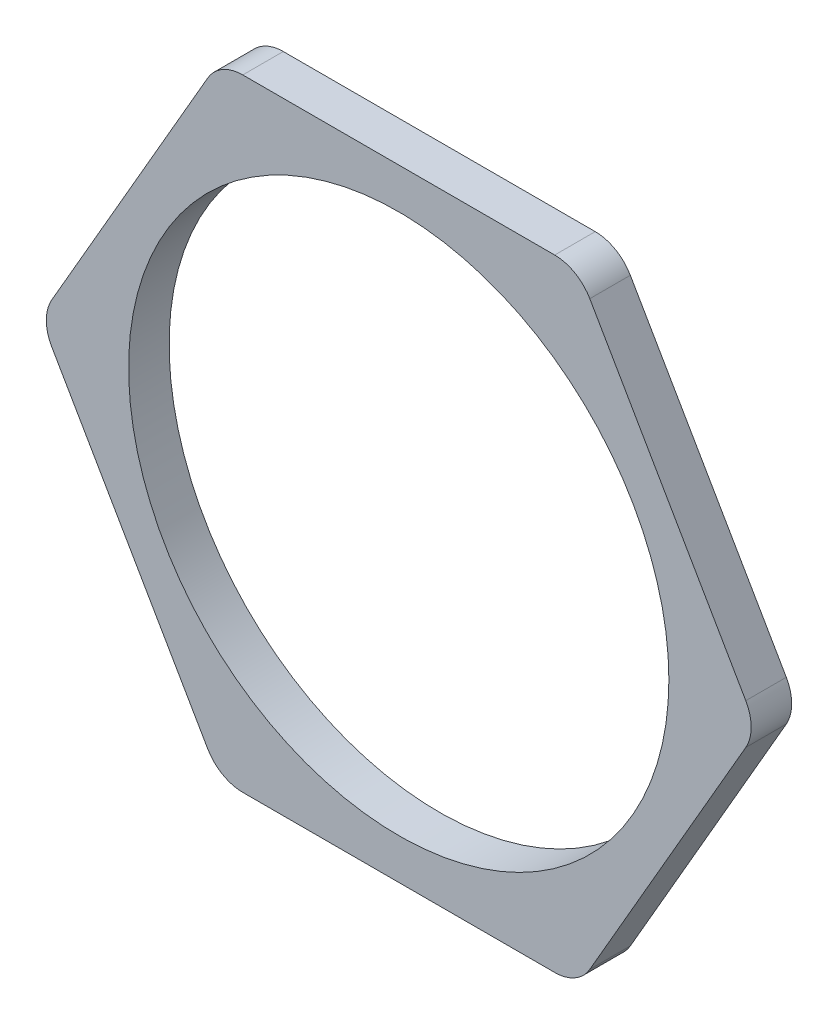
ISO-10303-21;
HEADER;
FILE_DESCRIPTION(('STEP AP214'),'2;1');
FILE_NAME('part.step','',(''),(''),'','','');
FILE_SCHEMA(('AUTOMOTIVE_DESIGN { 1 0 10303 214 1 1 1 1 }'));
ENDSEC;
DATA;
#1=APPLICATION_CONTEXT('core data for automotive mechanical design processes');
#2=APPLICATION_PROTOCOL_DEFINITION('international standard','automotive_design',2000,#1);
#3=PRODUCT_CONTEXT('',#1,'mechanical');
#4=PRODUCT('Part','Part','',(#3));
#5=PRODUCT_RELATED_PRODUCT_CATEGORY('part','',(#4));
#6=PRODUCT_DEFINITION_FORMATION('','',#4);
#7=PRODUCT_DEFINITION_CONTEXT('part definition',#1,'design');
#8=PRODUCT_DEFINITION('design','',#6,#7);
#9=PRODUCT_DEFINITION_SHAPE('','',#8);
#10=(LENGTH_UNIT() NAMED_UNIT(*) SI_UNIT(.MILLI.,.METRE.));
#11=(NAMED_UNIT(*) PLANE_ANGLE_UNIT() SI_UNIT($,.RADIAN.));
#12=(NAMED_UNIT(*) SI_UNIT($,.STERADIAN.) SOLID_ANGLE_UNIT());
#13=UNCERTAINTY_MEASURE_WITH_UNIT(LENGTH_MEASURE(1.E-05),#10,'distance_accuracy_value','');
#14=(GEOMETRIC_REPRESENTATION_CONTEXT(3) GLOBAL_UNCERTAINTY_ASSIGNED_CONTEXT((#13)) GLOBAL_UNIT_ASSIGNED_CONTEXT((#10,
#11,#12)) REPRESENTATION_CONTEXT('',''));
#15=CARTESIAN_POINT('',(0.,0.,0.));
#16=DIRECTION('',(0.,0.,1.));
#17=DIRECTION('',(1.,0.,0.));
#18=AXIS2_PLACEMENT_3D('',#15,#16,#17);
#19=CARTESIAN_POINT('',(0.,0.,3.));
#20=DIRECTION('',(0.,0.,1.));
#21=DIRECTION('',(1.,0.,0.));
#22=AXIS2_PLACEMENT_3D('',#19,#20,#21);
#23=PLANE('',#22);
#24=DIRECTION('',(-1.,0.,0.));
#25=VECTOR('',#24,1.);
#26=CARTESIAN_POINT('',(-13.2790561913612,23.0000000000002,3.));
#27=LINE('',#26,#25);
#28=CARTESIAN_POINT('',(11.5470053837924,23.0000000000002,3.));
#29=VERTEX_POINT('',#28);
#30=CARTESIAN_POINT('',(-11.5470053837924,23.0000000000002,3.));
#31=VERTEX_POINT('',#30);
#32=EDGE_CURVE('E220',#29,#31,#27,.T.);
#33=ORIENTED_EDGE('',*,*,#32,.T.);
#34=CARTESIAN_POINT('',(-11.5470053837924,20.0000000000002,3.));
#35=DIRECTION('',(0.,0.,1.));
#36=DIRECTION('',(1.,0.,0.));
#37=AXIS2_PLACEMENT_3D('',#34,#35,#36);
#38=CIRCLE('',#37,3.);
#39=CARTESIAN_POINT('',(-14.1450815951457,21.5000000000002,3.));
#40=VERTEX_POINT('',#39);
#41=EDGE_CURVE('E181',#31,#40,#38,.T.);
#42=ORIENTED_EDGE('',*,*,#41,.T.);
#43=DIRECTION('',(-0.500000000000004,-0.866025403784437,0.));
#44=VECTOR('',#43,1.);
#45=CARTESIAN_POINT('',(-13.2790561913612,23.0000000000002,3.));
#46=LINE('',#45,#44);
#47=CARTESIAN_POINT('',(-25.6920869789384,1.5,3.));
#48=VERTEX_POINT('',#47);
#49=EDGE_CURVE('E143',#40,#48,#46,.T.);
#50=ORIENTED_EDGE('',*,*,#49,.T.);
#51=CARTESIAN_POINT('',(-23.0940107675851,0.,3.));
#52=DIRECTION('',(0.,0.,1.));
#53=DIRECTION('',(1.,0.,0.));
#54=AXIS2_PLACEMENT_3D('',#51,#52,#53);
#55=CIRCLE('',#54,3.);
#56=CARTESIAN_POINT('',(-25.6920869789384,-1.50000000000001,3.));
#57=VERTEX_POINT('',#56);
#58=EDGE_CURVE('E179',#48,#57,#55,.T.);
#59=ORIENTED_EDGE('',*,*,#58,.T.);
#60=DIRECTION('',(0.500000000000004,-0.866025403784436,0.));
#61=VECTOR('',#60,1.);
#62=CARTESIAN_POINT('',(-13.2790561913612,-23.0000000000002,3.));
#63=LINE('',#62,#61);
#64=CARTESIAN_POINT('',(-14.1450815951457,-21.5000000000002,3.));
#65=VERTEX_POINT('',#64);
#66=EDGE_CURVE('E150',#57,#65,#63,.T.);
#67=ORIENTED_EDGE('',*,*,#66,.T.);
#68=CARTESIAN_POINT('',(-11.5470053837924,-20.0000000000002,3.));
#69=DIRECTION('',(0.,0.,1.));
#70=DIRECTION('',(1.,0.,0.));
#71=AXIS2_PLACEMENT_3D('',#68,#69,#70);
#72=CIRCLE('',#71,3.);
#73=CARTESIAN_POINT('',(-11.5470053837924,-23.0000000000002,3.));
#74=VERTEX_POINT('',#73);
#75=EDGE_CURVE('E177',#65,#74,#72,.T.);
#76=ORIENTED_EDGE('',*,*,#75,.T.);
#77=DIRECTION('',(1.,0.,0.));
#78=VECTOR('',#77,1.);
#79=CARTESIAN_POINT('',(-13.2790561913612,-23.0000000000002,3.));
#80=LINE('',#79,#78);
#81=CARTESIAN_POINT('',(11.5470053837924,-23.0000000000002,3.));
#82=VERTEX_POINT('',#81);
#83=EDGE_CURVE('E154',#74,#82,#80,.T.);
#84=ORIENTED_EDGE('',*,*,#83,.T.);
#85=CARTESIAN_POINT('',(11.5470053837924,-20.0000000000002,3.));
#86=DIRECTION('',(0.,0.,1.));
#87=DIRECTION('',(1.,0.,0.));
#88=AXIS2_PLACEMENT_3D('',#85,#86,#87);
#89=CIRCLE('',#88,3.);
#90=CARTESIAN_POINT('',(14.1450815951457,-21.5000000000002,3.));
#91=VERTEX_POINT('',#90);
#92=EDGE_CURVE('E175',#82,#91,#89,.T.);
#93=ORIENTED_EDGE('',*,*,#92,.T.);
#94=DIRECTION('',(0.500000000000004,0.866025403784436,0.));
#95=VECTOR('',#94,1.);
#96=CARTESIAN_POINT('',(13.2790561913612,-23.0000000000002,3.));
#97=LINE('',#96,#95);
#98=CARTESIAN_POINT('',(25.6920869789384,-1.50000000000002,3.));
#99=VERTEX_POINT('',#98);
#100=EDGE_CURVE('E205',#91,#99,#97,.T.);
#101=ORIENTED_EDGE('',*,*,#100,.T.);
#102=CARTESIAN_POINT('',(23.0940107675851,0.,3.));
#103=DIRECTION('',(0.,0.,1.));
#104=DIRECTION('',(1.,0.,0.));
#105=AXIS2_PLACEMENT_3D('',#102,#103,#104);
#106=CIRCLE('',#105,3.);
#107=CARTESIAN_POINT('',(25.6920869789384,1.5,3.));
#108=VERTEX_POINT('',#107);
#109=EDGE_CURVE('E54',#99,#108,#106,.T.);
#110=ORIENTED_EDGE('',*,*,#109,.T.);
#111=DIRECTION('',(-0.500000000000004,0.866025403784437,0.));
#112=VECTOR('',#111,1.);
#113=CARTESIAN_POINT('',(13.2790561913612,23.0000000000002,3.));
#114=LINE('',#113,#112);
#115=CARTESIAN_POINT('',(14.1450815951457,21.5000000000002,3.));
#116=VERTEX_POINT('',#115);
#117=EDGE_CURVE('E223',#108,#116,#114,.T.);
#118=ORIENTED_EDGE('',*,*,#117,.T.);
#119=CARTESIAN_POINT('',(11.5470053837924,20.0000000000002,3.));
#120=DIRECTION('',(0.,0.,1.));
#121=DIRECTION('',(1.,0.,0.));
#122=AXIS2_PLACEMENT_3D('',#119,#120,#121);
#123=CIRCLE('',#122,3.);
#124=EDGE_CURVE('E172',#116,#29,#123,.T.);
#125=ORIENTED_EDGE('',*,*,#124,.T.);
#126=EDGE_LOOP('',(#33,#42,#50,#59,#67,#76,#84,#93,#101,#110,#118,#125));
#127=FACE_BOUND('',#126,.T.);
#128=CARTESIAN_POINT('',(0.,0.,3.));
#129=DIRECTION('',(0.,0.,1.));
#130=DIRECTION('',(1.,0.,0.));
#131=AXIS2_PLACEMENT_3D('',#128,#129,#130);
#132=CIRCLE('',#131,20.);
#133=CARTESIAN_POINT('',(20.,0.,3.));
#134=VERTEX_POINT('',#133);
#135=EDGE_CURVE('E218',#134,#134,#132,.T.);
#136=ORIENTED_EDGE('',*,*,#135,.F.);
#137=EDGE_LOOP('',(#136));
#138=FACE_BOUND('',#137,.T.);
#139=ADVANCED_FACE('F33',(#127,#138),#23,.T.);
#140=CARTESIAN_POINT('',(0.,0.,0.));
#141=DIRECTION('',(0.,0.,1.));
#142=DIRECTION('',(1.,0.,0.));
#143=AXIS2_PLACEMENT_3D('',#140,#141,#142);
#144=PLANE('',#143);
#145=DIRECTION('',(-0.500000000000004,-0.866025403784437,0.));
#146=VECTOR('',#145,1.);
#147=CARTESIAN_POINT('',(-13.2790561913612,23.0000000000002,0.));
#148=LINE('',#147,#146);
#149=CARTESIAN_POINT('',(-14.1450815951457,21.5000000000002,0.));
#150=VERTEX_POINT('',#149);
#151=CARTESIAN_POINT('',(-25.6920869789384,1.5,0.));
#152=VERTEX_POINT('',#151);
#153=EDGE_CURVE('E140',#150,#152,#148,.T.);
#154=ORIENTED_EDGE('',*,*,#153,.F.);
#155=CARTESIAN_POINT('',(-11.5470053837924,20.0000000000002,0.));
#156=DIRECTION('',(0.,0.,1.));
#157=DIRECTION('',(1.,0.,0.));
#158=AXIS2_PLACEMENT_3D('',#155,#156,#157);
#159=CIRCLE('',#158,3.);
#160=CARTESIAN_POINT('',(-11.5470053837924,23.0000000000002,0.));
#161=VERTEX_POINT('',#160);
#162=EDGE_CURVE('E123',#150,#161,#159,.F.);
#163=ORIENTED_EDGE('',*,*,#162,.T.);
#164=DIRECTION('',(-1.,0.,0.));
#165=VECTOR('',#164,1.);
#166=CARTESIAN_POINT('',(-13.2790561913612,23.0000000000002,0.));
#167=LINE('',#166,#165);
#168=CARTESIAN_POINT('',(11.5470053837924,23.0000000000002,0.));
#169=VERTEX_POINT('',#168);
#170=EDGE_CURVE('E151',#169,#161,#167,.T.);
#171=ORIENTED_EDGE('',*,*,#170,.F.);
#172=CARTESIAN_POINT('',(11.5470053837924,20.0000000000002,0.));
#173=DIRECTION('',(0.,0.,1.));
#174=DIRECTION('',(1.,0.,0.));
#175=AXIS2_PLACEMENT_3D('',#172,#173,#174);
#176=CIRCLE('',#175,3.);
#177=CARTESIAN_POINT('',(14.1450815951457,21.5000000000002,0.));
#178=VERTEX_POINT('',#177);
#179=EDGE_CURVE('E144',#169,#178,#176,.F.);
#180=ORIENTED_EDGE('',*,*,#179,.T.);
#181=DIRECTION('',(-0.500000000000004,0.866025403784437,0.));
#182=VECTOR('',#181,1.);
#183=CARTESIAN_POINT('',(13.2790561913612,23.0000000000002,0.));
#184=LINE('',#183,#182);
#185=CARTESIAN_POINT('',(25.6920869789384,1.5,0.));
#186=VERTEX_POINT('',#185);
#187=EDGE_CURVE('E156',#186,#178,#184,.T.);
#188=ORIENTED_EDGE('',*,*,#187,.F.);
#189=CARTESIAN_POINT('',(23.0940107675851,0.,0.));
#190=DIRECTION('',(0.,0.,1.));
#191=DIRECTION('',(1.,0.,0.));
#192=AXIS2_PLACEMENT_3D('',#189,#190,#191);
#193=CIRCLE('',#192,3.);
#194=CARTESIAN_POINT('',(25.6920869789384,-1.50000000000002,0.));
#195=VERTEX_POINT('',#194);
#196=EDGE_CURVE('E162',#186,#195,#193,.F.);
#197=ORIENTED_EDGE('',*,*,#196,.T.);
#198=DIRECTION('',(0.500000000000004,0.866025403784436,0.));
#199=VECTOR('',#198,1.);
#200=CARTESIAN_POINT('',(13.2790561913612,-23.0000000000002,0.));
#201=LINE('',#200,#199);
#202=CARTESIAN_POINT('',(14.1450815951457,-21.5000000000002,0.));
#203=VERTEX_POINT('',#202);
#204=EDGE_CURVE('E203',#203,#195,#201,.T.);
#205=ORIENTED_EDGE('',*,*,#204,.F.);
#206=CARTESIAN_POINT('',(11.5470053837924,-20.0000000000002,0.));
#207=DIRECTION('',(0.,0.,1.));
#208=DIRECTION('',(1.,0.,0.));
#209=AXIS2_PLACEMENT_3D('',#206,#207,#208);
#210=CIRCLE('',#209,3.);
#211=CARTESIAN_POINT('',(11.5470053837924,-23.0000000000002,0.));
#212=VERTEX_POINT('',#211);
#213=EDGE_CURVE('E164',#203,#212,#210,.F.);
#214=ORIENTED_EDGE('',*,*,#213,.T.);
#215=DIRECTION('',(1.,0.,0.));
#216=VECTOR('',#215,1.);
#217=CARTESIAN_POINT('',(-13.2790561913612,-23.0000000000002,0.));
#218=LINE('',#217,#216);
#219=CARTESIAN_POINT('',(-11.5470053837924,-23.0000000000002,0.));
#220=VERTEX_POINT('',#219);
#221=EDGE_CURVE('E211',#220,#212,#218,.T.);
#222=ORIENTED_EDGE('',*,*,#221,.F.);
#223=CARTESIAN_POINT('',(-11.5470053837924,-20.0000000000002,0.));
#224=DIRECTION('',(0.,0.,1.));
#225=DIRECTION('',(1.,0.,0.));
#226=AXIS2_PLACEMENT_3D('',#223,#224,#225);
#227=CIRCLE('',#226,3.);
#228=CARTESIAN_POINT('',(-14.1450815951457,-21.5000000000002,0.));
#229=VERTEX_POINT('',#228);
#230=EDGE_CURVE('E166',#220,#229,#227,.F.);
#231=ORIENTED_EDGE('',*,*,#230,.T.);
#232=DIRECTION('',(0.500000000000004,-0.866025403784436,0.));
#233=VECTOR('',#232,1.);
#234=CARTESIAN_POINT('',(-13.2790561913612,-23.0000000000002,0.));
#235=LINE('',#234,#233);
#236=CARTESIAN_POINT('',(-25.6920869789384,-1.50000000000001,0.));
#237=VERTEX_POINT('',#236);
#238=EDGE_CURVE('E213',#237,#229,#235,.T.);
#239=ORIENTED_EDGE('',*,*,#238,.F.);
#240=CARTESIAN_POINT('',(-23.0940107675851,0.,0.));
#241=DIRECTION('',(0.,0.,1.));
#242=DIRECTION('',(1.,0.,0.));
#243=AXIS2_PLACEMENT_3D('',#240,#241,#242);
#244=CIRCLE('',#243,3.);
#245=EDGE_CURVE('E134',#237,#152,#244,.F.);
#246=ORIENTED_EDGE('',*,*,#245,.T.);
#247=EDGE_LOOP('',(#154,#163,#171,#180,#188,#197,#205,#214,#222,#231,#239,#246));
#248=FACE_BOUND('',#247,.T.);
#249=CARTESIAN_POINT('',(0.,0.,0.));
#250=DIRECTION('',(0.,0.,1.));
#251=DIRECTION('',(1.,0.,0.));
#252=AXIS2_PLACEMENT_3D('',#249,#250,#251);
#253=CIRCLE('',#252,20.);
#254=CARTESIAN_POINT('',(20.,0.,0.));
#255=VERTEX_POINT('',#254);
#256=EDGE_CURVE('E228',#255,#255,#253,.T.);
#257=ORIENTED_EDGE('',*,*,#256,.T.);
#258=EDGE_LOOP('',(#257));
#259=FACE_BOUND('',#258,.T.);
#260=ADVANCED_FACE('F147',(#248,#259),#144,.F.);
#261=CARTESIAN_POINT('',(-13.2790561913612,-23.0000000000002,3.));
#262=DIRECTION('',(0.866025403784436,0.500000000000004,0.));
#263=DIRECTION('',(-0.500000000000004,0.866025403784436,0.));
#264=AXIS2_PLACEMENT_3D('',#261,#262,#263);
#265=PLANE('',#264);
#266=ORIENTED_EDGE('',*,*,#66,.F.);
#267=DIRECTION('',(0.,0.,-1.));
#268=VECTOR('',#267,1.);
#269=CARTESIAN_POINT('',(-25.6920869789384,-1.50000000000001,3.));
#270=LINE('',#269,#268);
#271=EDGE_CURVE('E185',#57,#237,#270,.T.);
#272=ORIENTED_EDGE('',*,*,#271,.T.);
#273=ORIENTED_EDGE('',*,*,#238,.T.);
#274=DIRECTION('',(0.,0.,-1.));
#275=VECTOR('',#274,1.);
#276=CARTESIAN_POINT('',(-14.1450815951457,-21.5000000000002,3.));
#277=LINE('',#276,#275);
#278=EDGE_CURVE('E183',#229,#65,#277,.F.);
#279=ORIENTED_EDGE('',*,*,#278,.T.);
#280=EDGE_LOOP('',(#266,#272,#273,#279));
#281=FACE_BOUND('',#280,.T.);
#282=ADVANCED_FACE('F242',(#281),#265,.F.);
#283=CARTESIAN_POINT('',(-13.2790561913612,-23.0000000000002,3.));
#284=DIRECTION('',(0.,1.,0.));
#285=DIRECTION('',(0.,0.,1.));
#286=AXIS2_PLACEMENT_3D('',#283,#284,#285);
#287=PLANE('',#286);
#288=ORIENTED_EDGE('',*,*,#83,.F.);
#289=DIRECTION('',(0.,0.,-1.));
#290=VECTOR('',#289,1.);
#291=CARTESIAN_POINT('',(-11.5470053837924,-23.0000000000002,3.));
#292=LINE('',#291,#290);
#293=EDGE_CURVE('E190',#74,#220,#292,.T.);
#294=ORIENTED_EDGE('',*,*,#293,.T.);
#295=ORIENTED_EDGE('',*,*,#221,.T.);
#296=DIRECTION('',(0.,0.,-1.));
#297=VECTOR('',#296,1.);
#298=CARTESIAN_POINT('',(11.5470053837924,-23.0000000000002,3.));
#299=LINE('',#298,#297);
#300=EDGE_CURVE('E188',#212,#82,#299,.F.);
#301=ORIENTED_EDGE('',*,*,#300,.T.);
#302=EDGE_LOOP('',(#288,#294,#295,#301));
#303=FACE_BOUND('',#302,.T.);
#304=ADVANCED_FACE('F257',(#303),#287,.F.);
#305=CARTESIAN_POINT('',(13.2790561913612,-23.0000000000002,3.));
#306=DIRECTION('',(-0.866025403784436,0.500000000000004,0.));
#307=DIRECTION('',(-0.500000000000004,-0.866025403784436,0.));
#308=AXIS2_PLACEMENT_3D('',#305,#306,#307);
#309=PLANE('',#308);
#310=ORIENTED_EDGE('',*,*,#100,.F.);
#311=DIRECTION('',(0.,0.,-1.));
#312=VECTOR('',#311,1.);
#313=CARTESIAN_POINT('',(14.1450815951457,-21.5000000000002,3.));
#314=LINE('',#313,#312);
#315=EDGE_CURVE('E195',#91,#203,#314,.T.);
#316=ORIENTED_EDGE('',*,*,#315,.T.);
#317=ORIENTED_EDGE('',*,*,#204,.T.);
#318=DIRECTION('',(0.,0.,-1.));
#319=VECTOR('',#318,1.);
#320=CARTESIAN_POINT('',(25.6920869789384,-1.50000000000002,3.));
#321=LINE('',#320,#319);
#322=EDGE_CURVE('E193',#195,#99,#321,.F.);
#323=ORIENTED_EDGE('',*,*,#322,.T.);
#324=EDGE_LOOP('',(#310,#316,#317,#323));
#325=FACE_BOUND('',#324,.T.);
#326=ADVANCED_FACE('F202',(#325),#309,.F.);
#327=CARTESIAN_POINT('',(13.2790561913612,23.0000000000002,3.));
#328=DIRECTION('',(-0.866025403784436,-0.500000000000004,0.));
#329=DIRECTION('',(0.500000000000004,-0.866025403784437,0.));
#330=AXIS2_PLACEMENT_3D('',#327,#328,#329);
#331=PLANE('',#330);
#332=ORIENTED_EDGE('',*,*,#117,.F.);
#333=DIRECTION('',(0.,0.,-1.));
#334=VECTOR('',#333,1.);
#335=CARTESIAN_POINT('',(25.6920869789384,1.5,3.));
#336=LINE('',#335,#334);
#337=EDGE_CURVE('E11',#108,#186,#336,.T.);
#338=ORIENTED_EDGE('',*,*,#337,.T.);
#339=ORIENTED_EDGE('',*,*,#187,.T.);
#340=DIRECTION('',(0.,0.,-1.));
#341=VECTOR('',#340,1.);
#342=CARTESIAN_POINT('',(14.1450815951457,21.5000000000002,3.));
#343=LINE('',#342,#341);
#344=EDGE_CURVE('E41',#178,#116,#343,.F.);
#345=ORIENTED_EDGE('',*,*,#344,.T.);
#346=EDGE_LOOP('',(#332,#338,#339,#345));
#347=FACE_BOUND('',#346,.T.);
#348=ADVANCED_FACE('F251',(#347),#331,.F.);
#349=CARTESIAN_POINT('',(-13.2790561913612,23.0000000000002,3.));
#350=DIRECTION('',(0.,-1.,0.));
#351=DIRECTION('',(0.,0.,-1.));
#352=AXIS2_PLACEMENT_3D('',#349,#350,#351);
#353=PLANE('',#352);
#354=ORIENTED_EDGE('',*,*,#170,.T.);
#355=DIRECTION('',(0.,0.,-1.));
#356=VECTOR('',#355,1.);
#357=CARTESIAN_POINT('',(-11.5470053837924,23.0000000000002,3.));
#358=LINE('',#357,#356);
#359=EDGE_CURVE('E128',#161,#31,#358,.F.);
#360=ORIENTED_EDGE('',*,*,#359,.T.);
#361=ORIENTED_EDGE('',*,*,#32,.F.);
#362=DIRECTION('',(0.,0.,-1.));
#363=VECTOR('',#362,1.);
#364=CARTESIAN_POINT('',(11.5470053837924,23.0000000000002,3.));
#365=LINE('',#364,#363);
#366=EDGE_CURVE('E133',#29,#169,#365,.T.);
#367=ORIENTED_EDGE('',*,*,#366,.T.);
#368=EDGE_LOOP('',(#354,#360,#361,#367));
#369=FACE_BOUND('',#368,.T.);
#370=ADVANCED_FACE('F248',(#369),#353,.F.);
#371=CARTESIAN_POINT('',(-13.2790561913612,23.0000000000002,3.));
#372=DIRECTION('',(0.866025403784436,-0.500000000000004,0.));
#373=DIRECTION('',(0.500000000000004,0.866025403784437,0.));
#374=AXIS2_PLACEMENT_3D('',#371,#372,#373);
#375=PLANE('',#374);
#376=ORIENTED_EDGE('',*,*,#49,.F.);
#377=DIRECTION('',(0.,0.,-1.));
#378=VECTOR('',#377,1.);
#379=CARTESIAN_POINT('',(-14.1450815951457,21.5000000000002,3.));
#380=LINE('',#379,#378);
#381=EDGE_CURVE('E127',#40,#150,#380,.T.);
#382=ORIENTED_EDGE('',*,*,#381,.T.);
#383=ORIENTED_EDGE('',*,*,#153,.T.);
#384=DIRECTION('',(0.,0.,-1.));
#385=VECTOR('',#384,1.);
#386=CARTESIAN_POINT('',(-25.6920869789384,1.5,3.));
#387=LINE('',#386,#385);
#388=EDGE_CURVE('E145',#152,#48,#387,.F.);
#389=ORIENTED_EDGE('',*,*,#388,.T.);
#390=EDGE_LOOP('',(#376,#382,#383,#389));
#391=FACE_BOUND('',#390,.T.);
#392=ADVANCED_FACE('F139',(#391),#375,.F.);
#393=CARTESIAN_POINT('',(0.,0.,3.));
#394=DIRECTION('',(0.,0.,-1.));
#395=DIRECTION('',(-1.,0.,0.));
#396=AXIS2_PLACEMENT_3D('',#393,#394,#395);
#397=CYLINDRICAL_SURFACE('',#396,20.);
#398=ORIENTED_EDGE('',*,*,#135,.T.);
#399=EDGE_LOOP('',(#398));
#400=FACE_BOUND('',#399,.T.);
#401=ORIENTED_EDGE('',*,*,#256,.F.);
#402=EDGE_LOOP('',(#401));
#403=FACE_BOUND('',#402,.T.);
#404=ADVANCED_FACE('F234',(#400,#403),#397,.F.);
#405=CARTESIAN_POINT('',(-11.5470053837924,20.0000000000002,3.));
#406=DIRECTION('',(0.,0.,-1.));
#407=DIRECTION('',(-1.,0.,0.));
#408=AXIS2_PLACEMENT_3D('',#405,#406,#407);
#409=CYLINDRICAL_SURFACE('',#408,3.);
#410=ORIENTED_EDGE('',*,*,#41,.F.);
#411=ORIENTED_EDGE('',*,*,#359,.F.);
#412=ORIENTED_EDGE('',*,*,#162,.F.);
#413=ORIENTED_EDGE('',*,*,#381,.F.);
#414=EDGE_LOOP('',(#410,#411,#412,#413));
#415=FACE_BOUND('',#414,.T.);
#416=ADVANCED_FACE('F126',(#415),#409,.T.);
#417=CARTESIAN_POINT('',(-23.0940107675851,0.,3.));
#418=DIRECTION('',(0.,0.,-1.));
#419=DIRECTION('',(-1.,0.,0.));
#420=AXIS2_PLACEMENT_3D('',#417,#418,#419);
#421=CYLINDRICAL_SURFACE('',#420,3.);
#422=ORIENTED_EDGE('',*,*,#58,.F.);
#423=ORIENTED_EDGE('',*,*,#388,.F.);
#424=ORIENTED_EDGE('',*,*,#245,.F.);
#425=ORIENTED_EDGE('',*,*,#271,.F.);
#426=EDGE_LOOP('',(#422,#423,#424,#425));
#427=FACE_BOUND('',#426,.T.);
#428=ADVANCED_FACE('F266',(#427),#421,.T.);
#429=CARTESIAN_POINT('',(-11.5470053837924,-20.0000000000002,3.));
#430=DIRECTION('',(0.,0.,-1.));
#431=DIRECTION('',(-1.,0.,0.));
#432=AXIS2_PLACEMENT_3D('',#429,#430,#431);
#433=CYLINDRICAL_SURFACE('',#432,3.);
#434=ORIENTED_EDGE('',*,*,#75,.F.);
#435=ORIENTED_EDGE('',*,*,#278,.F.);
#436=ORIENTED_EDGE('',*,*,#230,.F.);
#437=ORIENTED_EDGE('',*,*,#293,.F.);
#438=EDGE_LOOP('',(#434,#435,#436,#437));
#439=FACE_BOUND('',#438,.T.);
#440=ADVANCED_FACE('F269',(#439),#433,.T.);
#441=CARTESIAN_POINT('',(11.5470053837924,-20.0000000000002,3.));
#442=DIRECTION('',(0.,0.,-1.));
#443=DIRECTION('',(-1.,0.,0.));
#444=AXIS2_PLACEMENT_3D('',#441,#442,#443);
#445=CYLINDRICAL_SURFACE('',#444,3.);
#446=ORIENTED_EDGE('',*,*,#92,.F.);
#447=ORIENTED_EDGE('',*,*,#300,.F.);
#448=ORIENTED_EDGE('',*,*,#213,.F.);
#449=ORIENTED_EDGE('',*,*,#315,.F.);
#450=EDGE_LOOP('',(#446,#447,#448,#449));
#451=FACE_BOUND('',#450,.T.);
#452=ADVANCED_FACE('F273',(#451),#445,.T.);
#453=CARTESIAN_POINT('',(23.0940107675851,0.,3.));
#454=DIRECTION('',(0.,0.,-1.));
#455=DIRECTION('',(-1.,0.,0.));
#456=AXIS2_PLACEMENT_3D('',#453,#454,#455);
#457=CYLINDRICAL_SURFACE('',#456,3.);
#458=ORIENTED_EDGE('',*,*,#109,.F.);
#459=ORIENTED_EDGE('',*,*,#322,.F.);
#460=ORIENTED_EDGE('',*,*,#196,.F.);
#461=ORIENTED_EDGE('',*,*,#337,.F.);
#462=EDGE_LOOP('',(#458,#459,#460,#461));
#463=FACE_BOUND('',#462,.T.);
#464=ADVANCED_FACE('F276',(#463),#457,.T.);
#465=CARTESIAN_POINT('',(11.5470053837924,20.0000000000002,3.));
#466=DIRECTION('',(0.,0.,-1.));
#467=DIRECTION('',(-1.,0.,0.));
#468=AXIS2_PLACEMENT_3D('',#465,#466,#467);
#469=CYLINDRICAL_SURFACE('',#468,3.);
#470=ORIENTED_EDGE('',*,*,#124,.F.);
#471=ORIENTED_EDGE('',*,*,#344,.F.);
#472=ORIENTED_EDGE('',*,*,#179,.F.);
#473=ORIENTED_EDGE('',*,*,#366,.F.);
#474=EDGE_LOOP('',(#470,#471,#472,#473));
#475=FACE_BOUND('',#474,.T.);
#476=ADVANCED_FACE('F35',(#475),#469,.T.);
#477=CLOSED_SHELL('',(#139,#260,#282,#304,#326,#348,#370,#392,#404,#416,#428,#440,#452,#464,#476));
#478=MANIFOLD_SOLID_BREP('B2',#477);
#479=ADVANCED_BREP_SHAPE_REPRESENTATION('',(#18,#478),#14);
#480=SHAPE_DEFINITION_REPRESENTATION(#9,#479);
ENDSEC;
END-ISO-10303-21;
